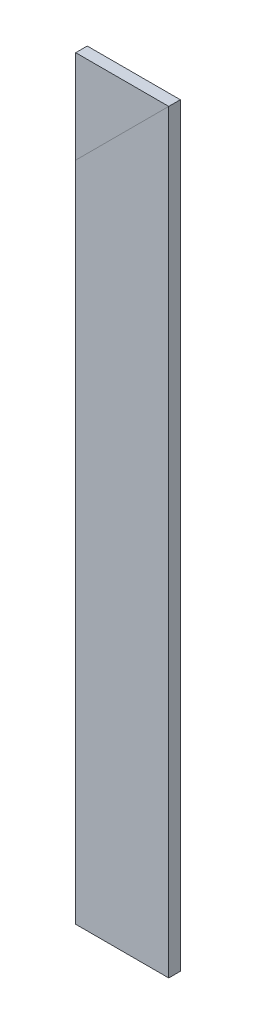
ISO-10303-21;
HEADER;
FILE_DESCRIPTION(('STEP AP214'),'2;1');
FILE_NAME('part.step','',(''),(''),'','','');
FILE_SCHEMA(('AUTOMOTIVE_DESIGN { 1 0 10303 214 1 1 1 1 }'));
ENDSEC;
DATA;
#1=APPLICATION_CONTEXT('core data for automotive mechanical design processes');
#2=APPLICATION_PROTOCOL_DEFINITION('international standard','automotive_design',2000,#1);
#3=PRODUCT_CONTEXT('',#1,'mechanical');
#4=PRODUCT('Part','Part','',(#3));
#5=PRODUCT_RELATED_PRODUCT_CATEGORY('part','',(#4));
#6=PRODUCT_DEFINITION_FORMATION('','',#4);
#7=PRODUCT_DEFINITION_CONTEXT('part definition',#1,'design');
#8=PRODUCT_DEFINITION('design','',#6,#7);
#9=PRODUCT_DEFINITION_SHAPE('','',#8);
#10=(LENGTH_UNIT() NAMED_UNIT(*) SI_UNIT(.MILLI.,.METRE.));
#11=(NAMED_UNIT(*) PLANE_ANGLE_UNIT() SI_UNIT($,.RADIAN.));
#12=(NAMED_UNIT(*) SI_UNIT($,.STERADIAN.) SOLID_ANGLE_UNIT());
#13=UNCERTAINTY_MEASURE_WITH_UNIT(LENGTH_MEASURE(1.E-05),#10,'distance_accuracy_value','');
#14=(GEOMETRIC_REPRESENTATION_CONTEXT(3) GLOBAL_UNCERTAINTY_ASSIGNED_CONTEXT((#13)) GLOBAL_UNIT_ASSIGNED_CONTEXT((#10,
#11,#12)) REPRESENTATION_CONTEXT('',''));
#15=CARTESIAN_POINT('',(0.,0.,0.));
#16=DIRECTION('',(0.,0.,1.));
#17=DIRECTION('',(1.,0.,0.));
#18=AXIS2_PLACEMENT_3D('',#15,#16,#17);
#19=CARTESIAN_POINT('',(505.4,28.04,-56.845));
#20=DIRECTION('',(0.,0.,1.));
#21=DIRECTION('',(1.,0.,0.));
#22=AXIS2_PLACEMENT_3D('',#19,#20,#21);
#23=PLANE('',#22);
#24=DIRECTION('',(0.,-1.,0.));
#25=VECTOR('',#24,1.);
#26=CARTESIAN_POINT('',(454.6,28.04,-56.845));
#27=LINE('',#26,#25);
#28=CARTESIAN_POINT('',(454.6,-25.4,-56.845));
#29=VERTEX_POINT('',#28);
#30=CARTESIAN_POINT('',(454.6,-386.69,-56.845));
#31=VERTEX_POINT('',#30);
#32=EDGE_CURVE('E106',#29,#31,#27,.T.);
#33=ORIENTED_EDGE('',*,*,#32,.T.);
#34=DIRECTION('',(-1.,0.,0.));
#35=VECTOR('',#34,1.);
#36=CARTESIAN_POINT('',(505.4,-386.69,-56.845));
#37=LINE('',#36,#35);
#38=CARTESIAN_POINT('',(505.4,-386.69,-56.845));
#39=VERTEX_POINT('',#38);
#40=EDGE_CURVE('E115',#39,#31,#37,.T.);
#41=ORIENTED_EDGE('',*,*,#40,.F.);
#42=DIRECTION('',(0.,-1.,0.));
#43=VECTOR('',#42,1.);
#44=CARTESIAN_POINT('',(505.4,28.04,-56.845));
#45=LINE('',#44,#43);
#46=CARTESIAN_POINT('',(505.4,25.4,-56.845));
#47=VERTEX_POINT('',#46);
#48=EDGE_CURVE('E101',#47,#39,#45,.T.);
#49=ORIENTED_EDGE('',*,*,#48,.F.);
#50=DIRECTION('',(0.707106781186548,0.707106781186548,0.));
#51=VECTOR('',#50,1.);
#52=CARTESIAN_POINT('',(336.41475,-143.58525,-56.845));
#53=LINE('',#52,#51);
#54=EDGE_CURVE('E103',#29,#47,#53,.T.);
#55=ORIENTED_EDGE('',*,*,#54,.F.);
#56=EDGE_LOOP('',(#33,#41,#49,#55));
#57=FACE_BOUND('',#56,.T.);
#58=ADVANCED_FACE('F32',(#57),#23,.T.);
#59=CARTESIAN_POINT('',(480.,-386.69,-60.));
#60=DIRECTION('',(0.,-1.,0.));
#61=DIRECTION('',(0.,0.,-1.));
#62=AXIS2_PLACEMENT_3D('',#59,#60,#61);
#63=PLANE('',#62);
#64=ORIENTED_EDGE('',*,*,#40,.T.);
#65=DIRECTION('',(0.,0.,-1.));
#66=VECTOR('',#65,1.);
#67=CARTESIAN_POINT('',(454.6,-386.69,-56.845));
#68=LINE('',#67,#66);
#69=CARTESIAN_POINT('',(454.6,-386.69,-63.155));
#70=VERTEX_POINT('',#69);
#71=EDGE_CURVE('E64',#31,#70,#68,.T.);
#72=ORIENTED_EDGE('',*,*,#71,.T.);
#73=DIRECTION('',(1.,0.,0.));
#74=VECTOR('',#73,1.);
#75=CARTESIAN_POINT('',(505.4,-386.69,-63.155));
#76=LINE('',#75,#74);
#77=CARTESIAN_POINT('',(505.4,-386.69,-63.155));
#78=VERTEX_POINT('',#77);
#79=EDGE_CURVE('E112',#70,#78,#76,.T.);
#80=ORIENTED_EDGE('',*,*,#79,.T.);
#81=DIRECTION('',(0.,0.,1.));
#82=VECTOR('',#81,1.);
#83=CARTESIAN_POINT('',(505.4,-386.69,-56.845));
#84=LINE('',#83,#82);
#85=EDGE_CURVE('E68',#78,#39,#84,.T.);
#86=ORIENTED_EDGE('',*,*,#85,.T.);
#87=EDGE_LOOP('',(#64,#72,#80,#86));
#88=FACE_BOUND('',#87,.T.);
#89=ADVANCED_FACE('F34',(#88),#63,.T.);
#90=CARTESIAN_POINT('',(454.6,28.04,-56.845));
#91=DIRECTION('',(-1.,0.,0.));
#92=DIRECTION('',(0.,0.,1.));
#93=AXIS2_PLACEMENT_3D('',#90,#91,#92);
#94=PLANE('',#93);
#95=ORIENTED_EDGE('',*,*,#71,.F.);
#96=ORIENTED_EDGE('',*,*,#32,.F.);
#97=DIRECTION('',(0.,1.,0.));
#98=VECTOR('',#97,1.);
#99=CARTESIAN_POINT('',(454.6,25.4,-56.845));
#100=LINE('',#99,#98);
#101=CARTESIAN_POINT('',(454.6,25.4,-56.845));
#102=VERTEX_POINT('',#101);
#103=EDGE_CURVE('E11',#29,#102,#100,.T.);
#104=ORIENTED_EDGE('',*,*,#103,.T.);
#105=DIRECTION('',(0.,0.,-1.));
#106=VECTOR('',#105,1.);
#107=CARTESIAN_POINT('',(454.6,25.4,3.845));
#108=LINE('',#107,#106);
#109=CARTESIAN_POINT('',(454.6,25.4,-63.155));
#110=VERTEX_POINT('',#109);
#111=EDGE_CURVE('E86',#102,#110,#108,.T.);
#112=ORIENTED_EDGE('',*,*,#111,.T.);
#113=DIRECTION('',(0.,-1.,0.));
#114=VECTOR('',#113,1.);
#115=CARTESIAN_POINT('',(454.6,-25.4,-63.155));
#116=LINE('',#115,#114);
#117=CARTESIAN_POINT('',(454.6,-25.4,-63.155));
#118=VERTEX_POINT('',#117);
#119=EDGE_CURVE('E89',#110,#118,#116,.T.);
#120=ORIENTED_EDGE('',*,*,#119,.T.);
#121=DIRECTION('',(0.,-1.,0.));
#122=VECTOR('',#121,1.);
#123=CARTESIAN_POINT('',(454.6,28.04,-63.155));
#124=LINE('',#123,#122);
#125=EDGE_CURVE('E120',#118,#70,#124,.T.);
#126=ORIENTED_EDGE('',*,*,#125,.T.);
#127=EDGE_LOOP('',(#95,#96,#104,#112,#120,#126));
#128=FACE_BOUND('',#127,.T.);
#129=ADVANCED_FACE('F87',(#128),#94,.T.);
#130=CARTESIAN_POINT('',(505.4,28.04,-63.155));
#131=DIRECTION('',(0.,0.,-1.));
#132=DIRECTION('',(-1.,0.,0.));
#133=AXIS2_PLACEMENT_3D('',#130,#131,#132);
#134=PLANE('',#133);
#135=DIRECTION('',(-0.707106781186548,-0.707106781186548,0.));
#136=VECTOR('',#135,1.);
#137=CARTESIAN_POINT('',(336.41475,-143.58525,-63.155));
#138=LINE('',#137,#136);
#139=CARTESIAN_POINT('',(505.4,25.4,-63.155));
#140=VERTEX_POINT('',#139);
#141=EDGE_CURVE('E41',#140,#118,#138,.T.);
#142=ORIENTED_EDGE('',*,*,#141,.F.);
#143=DIRECTION('',(0.,-1.,0.));
#144=VECTOR('',#143,1.);
#145=CARTESIAN_POINT('',(505.4,28.04,-63.155));
#146=LINE('',#145,#144);
#147=EDGE_CURVE('E117',#140,#78,#146,.T.);
#148=ORIENTED_EDGE('',*,*,#147,.T.);
#149=ORIENTED_EDGE('',*,*,#79,.F.);
#150=ORIENTED_EDGE('',*,*,#125,.F.);
#151=EDGE_LOOP('',(#142,#148,#149,#150));
#152=FACE_BOUND('',#151,.T.);
#153=ADVANCED_FACE('F126',(#152),#134,.T.);
#154=CARTESIAN_POINT('',(505.4,28.04,-56.845));
#155=DIRECTION('',(1.,0.,0.));
#156=DIRECTION('',(0.,0.,-1.));
#157=AXIS2_PLACEMENT_3D('',#154,#155,#156);
#158=PLANE('',#157);
#159=DIRECTION('',(0.,0.,-1.));
#160=VECTOR('',#159,1.);
#161=CARTESIAN_POINT('',(505.4,25.4,-56.845));
#162=LINE('',#161,#160);
#163=EDGE_CURVE('E99',#47,#140,#162,.T.);
#164=ORIENTED_EDGE('',*,*,#163,.F.);
#165=ORIENTED_EDGE('',*,*,#48,.T.);
#166=ORIENTED_EDGE('',*,*,#85,.F.);
#167=ORIENTED_EDGE('',*,*,#147,.F.);
#168=EDGE_LOOP('',(#164,#165,#166,#167));
#169=FACE_BOUND('',#168,.T.);
#170=ADVANCED_FACE('F129',(#169),#158,.T.);
#171=CARTESIAN_POINT('',(167.4295,25.4,-56.845));
#172=DIRECTION('',(0.,1.,0.));
#173=DIRECTION('',(0.,0.,1.));
#174=AXIS2_PLACEMENT_3D('',#171,#172,#173);
#175=PLANE('',#174);
#176=ORIENTED_EDGE('',*,*,#111,.F.);
#177=DIRECTION('',(1.,0.,0.));
#178=VECTOR('',#177,1.);
#179=CARTESIAN_POINT('',(167.4295,25.4,-56.845));
#180=LINE('',#179,#178);
#181=EDGE_CURVE('E100',#102,#47,#180,.T.);
#182=ORIENTED_EDGE('',*,*,#181,.T.);
#183=ORIENTED_EDGE('',*,*,#163,.T.);
#184=DIRECTION('',(1.,0.,0.));
#185=VECTOR('',#184,1.);
#186=CARTESIAN_POINT('',(167.4295,25.4,-63.155));
#187=LINE('',#186,#185);
#188=EDGE_CURVE('E49',#110,#140,#187,.T.);
#189=ORIENTED_EDGE('',*,*,#188,.F.);
#190=EDGE_LOOP('',(#176,#182,#183,#189));
#191=FACE_BOUND('',#190,.T.);
#192=ADVANCED_FACE('F97',(#191),#175,.T.);
#193=CARTESIAN_POINT('',(167.4295,25.4,-63.155));
#194=DIRECTION('',(0.,0.,-1.));
#195=DIRECTION('',(0.,1.,0.));
#196=AXIS2_PLACEMENT_3D('',#193,#194,#195);
#197=PLANE('',#196);
#198=ORIENTED_EDGE('',*,*,#119,.F.);
#199=ORIENTED_EDGE('',*,*,#188,.T.);
#200=ORIENTED_EDGE('',*,*,#141,.T.);
#201=EDGE_LOOP('',(#198,#199,#200));
#202=FACE_BOUND('',#201,.T.);
#203=ADVANCED_FACE('F94',(#202),#197,.T.);
#204=CARTESIAN_POINT('',(167.4295,25.4,-56.845));
#205=DIRECTION('',(0.,0.,1.));
#206=DIRECTION('',(0.,-1.,0.));
#207=AXIS2_PLACEMENT_3D('',#204,#205,#206);
#208=PLANE('',#207);
#209=ORIENTED_EDGE('',*,*,#103,.F.);
#210=ORIENTED_EDGE('',*,*,#54,.T.);
#211=ORIENTED_EDGE('',*,*,#181,.F.);
#212=EDGE_LOOP('',(#209,#210,#211));
#213=FACE_BOUND('',#212,.T.);
#214=ADVANCED_FACE('F130',(#213),#208,.T.);
#215=CLOSED_SHELL('',(#58,#89,#129,#153,#170,#192,#203,#214));
#216=MANIFOLD_SOLID_BREP('B2',#215);
#217=ADVANCED_BREP_SHAPE_REPRESENTATION('',(#18,#216),#14);
#218=SHAPE_DEFINITION_REPRESENTATION(#9,#217);
ENDSEC;
END-ISO-10303-21;
